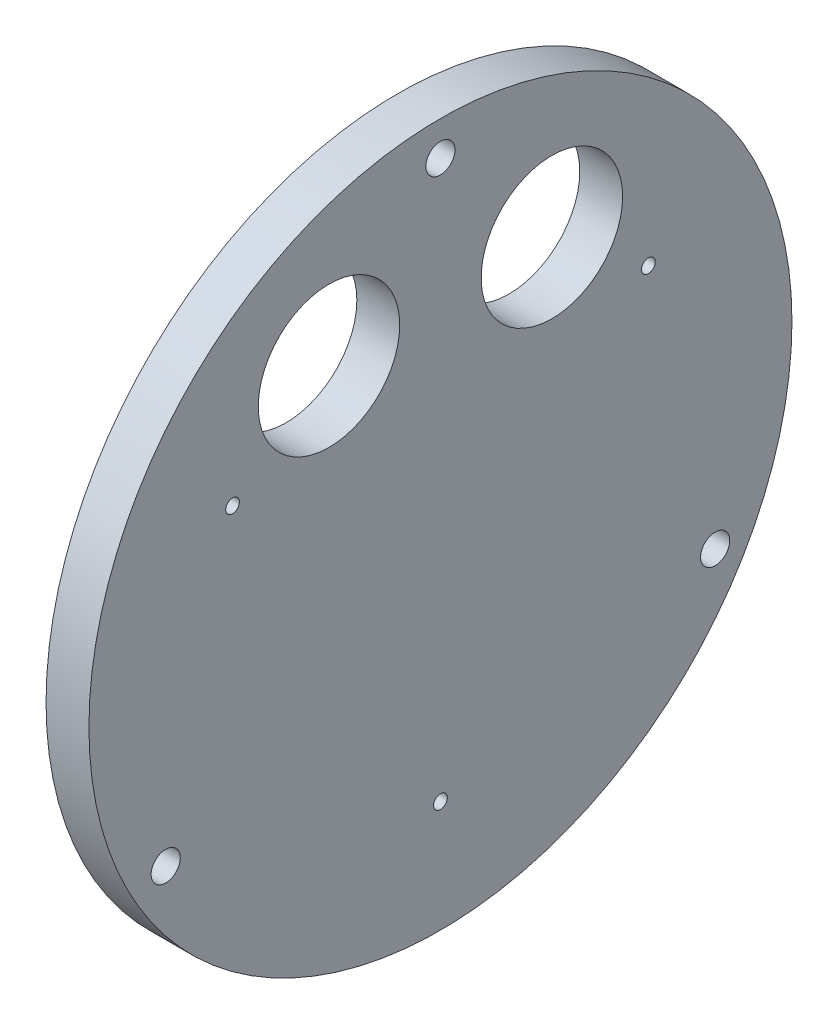
ISO-10303-21;
HEADER;
FILE_DESCRIPTION(('STEP AP214'),'2;1');
FILE_NAME('part.step','',(''),(''),'','','');
FILE_SCHEMA(('AUTOMOTIVE_DESIGN { 1 0 10303 214 1 1 1 1 }'));
ENDSEC;
DATA;
#1=APPLICATION_CONTEXT('core data for automotive mechanical design processes');
#2=APPLICATION_PROTOCOL_DEFINITION('international standard','automotive_design',2000,#1);
#3=PRODUCT_CONTEXT('',#1,'mechanical');
#4=PRODUCT('Part','Part','',(#3));
#5=PRODUCT_RELATED_PRODUCT_CATEGORY('part','',(#4));
#6=PRODUCT_DEFINITION_FORMATION('','',#4);
#7=PRODUCT_DEFINITION_CONTEXT('part definition',#1,'design');
#8=PRODUCT_DEFINITION('design','',#6,#7);
#9=PRODUCT_DEFINITION_SHAPE('','',#8);
#10=(LENGTH_UNIT() NAMED_UNIT(*) SI_UNIT(.MILLI.,.METRE.));
#11=(NAMED_UNIT(*) PLANE_ANGLE_UNIT() SI_UNIT($,.RADIAN.));
#12=(NAMED_UNIT(*) SI_UNIT($,.STERADIAN.) SOLID_ANGLE_UNIT());
#13=UNCERTAINTY_MEASURE_WITH_UNIT(LENGTH_MEASURE(1.E-05),#10,'distance_accuracy_value','');
#14=(GEOMETRIC_REPRESENTATION_CONTEXT(3) GLOBAL_UNCERTAINTY_ASSIGNED_CONTEXT((#13)) GLOBAL_UNIT_ASSIGNED_CONTEXT((#10,
#11,#12)) REPRESENTATION_CONTEXT('',''));
#15=CARTESIAN_POINT('',(0.,0.,0.));
#16=DIRECTION('',(0.,0.,1.));
#17=DIRECTION('',(1.,0.,0.));
#18=AXIS2_PLACEMENT_3D('',#15,#16,#17);
#19=CARTESIAN_POINT('',(-22.,41.,0.));
#20=DIRECTION('',(1.,0.,0.));
#21=DIRECTION('',(0.,0.,-1.));
#22=AXIS2_PLACEMENT_3D('',#19,#20,#21);
#23=PLANE('',#22);
#24=CARTESIAN_POINT('',(-22.,37.,0.));
#25=DIRECTION('',(1.,0.,0.));
#26=DIRECTION('',(0.,0.,-1.));
#27=AXIS2_PLACEMENT_3D('',#24,#25,#26);
#28=CIRCLE('',#27,1.7);
#29=CARTESIAN_POINT('',(-22.,37.,-1.7));
#30=VERTEX_POINT('',#29);
#31=EDGE_CURVE('E85',#30,#30,#28,.T.);
#32=ORIENTED_EDGE('',*,*,#31,.T.);
#33=EDGE_LOOP('',(#32));
#34=FACE_BOUND('',#33,.T.);
#35=CARTESIAN_POINT('',(-22.,-18.5,32.0429399400242));
#36=DIRECTION('',(1.,0.,0.));
#37=DIRECTION('',(0.,0.,-1.));
#38=AXIS2_PLACEMENT_3D('',#35,#36,#37);
#39=CIRCLE('',#38,1.7);
#40=CARTESIAN_POINT('',(-22.,-18.5,30.3429399400242));
#41=VERTEX_POINT('',#40);
#42=EDGE_CURVE('E78',#41,#41,#39,.T.);
#43=ORIENTED_EDGE('',*,*,#42,.T.);
#44=EDGE_LOOP('',(#43));
#45=FACE_BOUND('',#44,.T.);
#46=CARTESIAN_POINT('',(-22.,-18.5,-32.0429399400242));
#47=DIRECTION('',(1.,0.,0.));
#48=DIRECTION('',(0.,0.,-1.));
#49=AXIS2_PLACEMENT_3D('',#46,#47,#48);
#50=CIRCLE('',#49,1.7);
#51=CARTESIAN_POINT('',(-22.,-18.5,-33.7429399400242));
#52=VERTEX_POINT('',#51);
#53=EDGE_CURVE('E69',#52,#52,#50,.T.);
#54=ORIENTED_EDGE('',*,*,#53,.T.);
#55=EDGE_LOOP('',(#54));
#56=FACE_BOUND('',#55,.T.);
#57=CARTESIAN_POINT('',(-22.,22.5166604983954,13.));
#58=DIRECTION('',(1.,0.,0.));
#59=DIRECTION('',(0.,0.,-1.));
#60=AXIS2_PLACEMENT_3D('',#57,#58,#59);
#61=CIRCLE('',#60,8.25);
#62=CARTESIAN_POINT('',(-22.,22.5166604983954,4.75));
#63=VERTEX_POINT('',#62);
#64=EDGE_CURVE('E55',#63,#63,#61,.T.);
#65=ORIENTED_EDGE('',*,*,#64,.T.);
#66=EDGE_LOOP('',(#65));
#67=FACE_BOUND('',#66,.T.);
#68=CARTESIAN_POINT('',(-22.,22.5166604983954,-13.));
#69=DIRECTION('',(1.,0.,0.));
#70=DIRECTION('',(0.,0.,-1.));
#71=AXIS2_PLACEMENT_3D('',#68,#69,#70);
#72=CIRCLE('',#71,8.25);
#73=CARTESIAN_POINT('',(-22.,22.5166604983954,-21.25));
#74=VERTEX_POINT('',#73);
#75=EDGE_CURVE('E58',#74,#74,#72,.T.);
#76=ORIENTED_EDGE('',*,*,#75,.T.);
#77=EDGE_LOOP('',(#76));
#78=FACE_BOUND('',#77,.T.);
#79=CARTESIAN_POINT('',(-22.,0.,0.));
#80=DIRECTION('',(-1.,0.,0.));
#81=DIRECTION('',(0.,0.,1.));
#82=AXIS2_PLACEMENT_3D('',#79,#80,#81);
#83=CIRCLE('',#82,41.);
#84=CARTESIAN_POINT('',(-22.,0.,41.));
#85=VERTEX_POINT('',#84);
#86=EDGE_CURVE('E42',#85,#85,#83,.T.);
#87=ORIENTED_EDGE('',*,*,#86,.T.);
#88=EDGE_LOOP('',(#87));
#89=FACE_BOUND('',#88,.T.);
#90=ADVANCED_FACE('F35',(#34,#45,#56,#67,#78,#89),#23,.F.);
#91=CARTESIAN_POINT('',(-17.,0.,0.));
#92=DIRECTION('',(-1.,0.,0.));
#93=DIRECTION('',(0.,0.,1.));
#94=AXIS2_PLACEMENT_3D('',#91,#92,#93);
#95=PLANE('',#94);
#96=CARTESIAN_POINT('',(-17.,14.,24.2487113059643));
#97=DIRECTION('',(1.,0.,0.));
#98=DIRECTION('',(0.,0.,-1.));
#99=AXIS2_PLACEMENT_3D('',#96,#97,#98);
#100=CIRCLE('',#99,0.799999999999999);
#101=CARTESIAN_POINT('',(-17.,14.,23.4487113059643));
#102=VERTEX_POINT('',#101);
#103=EDGE_CURVE('E74',#102,#102,#100,.T.);
#104=ORIENTED_EDGE('',*,*,#103,.F.);
#105=EDGE_LOOP('',(#104));
#106=FACE_BOUND('',#105,.T.);
#107=CARTESIAN_POINT('',(-17.,-28.,0.));
#108=DIRECTION('',(1.,0.,0.));
#109=DIRECTION('',(0.,0.,-1.));
#110=AXIS2_PLACEMENT_3D('',#107,#108,#109);
#111=CIRCLE('',#110,0.8);
#112=CARTESIAN_POINT('',(-17.,-28.,-0.799999999999997));
#113=VERTEX_POINT('',#112);
#114=EDGE_CURVE('E104',#113,#113,#111,.T.);
#115=ORIENTED_EDGE('',*,*,#114,.F.);
#116=EDGE_LOOP('',(#115));
#117=FACE_BOUND('',#116,.T.);
#118=CARTESIAN_POINT('',(-17.,14.,-24.2487113059643));
#119=DIRECTION('',(1.,0.,0.));
#120=DIRECTION('',(0.,0.,-1.));
#121=AXIS2_PLACEMENT_3D('',#118,#119,#120);
#122=CIRCLE('',#121,0.799999999999999);
#123=CARTESIAN_POINT('',(-17.,14.,-25.0487113059643));
#124=VERTEX_POINT('',#123);
#125=EDGE_CURVE('E96',#124,#124,#122,.T.);
#126=ORIENTED_EDGE('',*,*,#125,.F.);
#127=EDGE_LOOP('',(#126));
#128=FACE_BOUND('',#127,.T.);
#129=CARTESIAN_POINT('',(-17.,37.,0.));
#130=DIRECTION('',(1.,0.,0.));
#131=DIRECTION('',(0.,0.,-1.));
#132=AXIS2_PLACEMENT_3D('',#129,#130,#131);
#133=CIRCLE('',#132,1.7);
#134=CARTESIAN_POINT('',(-17.,37.,-1.7));
#135=VERTEX_POINT('',#134);
#136=EDGE_CURVE('E63',#135,#135,#133,.T.);
#137=ORIENTED_EDGE('',*,*,#136,.F.);
#138=EDGE_LOOP('',(#137));
#139=FACE_BOUND('',#138,.T.);
#140=CARTESIAN_POINT('',(-17.,-18.5,32.0429399400242));
#141=DIRECTION('',(1.,0.,0.));
#142=DIRECTION('',(0.,0.,-1.));
#143=AXIS2_PLACEMENT_3D('',#140,#141,#142);
#144=CIRCLE('',#143,1.7);
#145=CARTESIAN_POINT('',(-17.,-18.5,30.3429399400242));
#146=VERTEX_POINT('',#145);
#147=EDGE_CURVE('E81',#146,#146,#144,.T.);
#148=ORIENTED_EDGE('',*,*,#147,.F.);
#149=EDGE_LOOP('',(#148));
#150=FACE_BOUND('',#149,.T.);
#151=CARTESIAN_POINT('',(-17.,-18.5,-32.0429399400242));
#152=DIRECTION('',(1.,0.,0.));
#153=DIRECTION('',(0.,0.,-1.));
#154=AXIS2_PLACEMENT_3D('',#151,#152,#153);
#155=CIRCLE('',#154,1.7);
#156=CARTESIAN_POINT('',(-17.,-18.5,-33.7429399400242));
#157=VERTEX_POINT('',#156);
#158=EDGE_CURVE('E73',#157,#157,#155,.T.);
#159=ORIENTED_EDGE('',*,*,#158,.F.);
#160=EDGE_LOOP('',(#159));
#161=FACE_BOUND('',#160,.T.);
#162=CARTESIAN_POINT('',(-17.,22.5166604983954,13.));
#163=DIRECTION('',(1.,0.,0.));
#164=DIRECTION('',(0.,0.,-1.));
#165=AXIS2_PLACEMENT_3D('',#162,#163,#164);
#166=CIRCLE('',#165,8.25);
#167=CARTESIAN_POINT('',(-17.,22.5166604983954,4.75));
#168=VERTEX_POINT('',#167);
#169=EDGE_CURVE('E49',#168,#168,#166,.T.);
#170=ORIENTED_EDGE('',*,*,#169,.F.);
#171=EDGE_LOOP('',(#170));
#172=FACE_BOUND('',#171,.T.);
#173=CARTESIAN_POINT('',(-17.,22.5166604983954,-13.));
#174=DIRECTION('',(1.,0.,0.));
#175=DIRECTION('',(0.,0.,-1.));
#176=AXIS2_PLACEMENT_3D('',#173,#174,#175);
#177=CIRCLE('',#176,8.25);
#178=CARTESIAN_POINT('',(-17.,22.5166604983954,-21.25));
#179=VERTEX_POINT('',#178);
#180=EDGE_CURVE('E62',#179,#179,#177,.T.);
#181=ORIENTED_EDGE('',*,*,#180,.F.);
#182=EDGE_LOOP('',(#181));
#183=FACE_BOUND('',#182,.T.);
#184=CARTESIAN_POINT('',(-17.,0.,0.));
#185=DIRECTION('',(-1.,0.,0.));
#186=DIRECTION('',(0.,0.,1.));
#187=AXIS2_PLACEMENT_3D('',#184,#185,#186);
#188=CIRCLE('',#187,41.);
#189=CARTESIAN_POINT('',(-17.,0.,41.));
#190=VERTEX_POINT('',#189);
#191=EDGE_CURVE('E10',#190,#190,#188,.T.);
#192=ORIENTED_EDGE('',*,*,#191,.F.);
#193=EDGE_LOOP('',(#192));
#194=FACE_BOUND('',#193,.T.);
#195=ADVANCED_FACE('F118',(#106,#117,#128,#139,#150,#161,#172,#183,#194),#95,.F.);
#196=CARTESIAN_POINT('',(-60.,0.,0.));
#197=DIRECTION('',(-1.,0.,0.));
#198=DIRECTION('',(0.,0.,1.));
#199=AXIS2_PLACEMENT_3D('',#196,#197,#198);
#200=CYLINDRICAL_SURFACE('',#199,41.);
#201=ORIENTED_EDGE('',*,*,#86,.F.);
#202=EDGE_LOOP('',(#201));
#203=FACE_BOUND('',#202,.T.);
#204=ORIENTED_EDGE('',*,*,#191,.T.);
#205=EDGE_LOOP('',(#204));
#206=FACE_BOUND('',#205,.T.);
#207=ADVANCED_FACE('F121',(#203,#206),#200,.T.);
#208=CARTESIAN_POINT('',(-17.,22.5166604983954,-13.));
#209=DIRECTION('',(-1.,0.,0.));
#210=DIRECTION('',(0.,0.,1.));
#211=AXIS2_PLACEMENT_3D('',#208,#209,#210);
#212=CYLINDRICAL_SURFACE('',#211,8.25);
#213=ORIENTED_EDGE('',*,*,#180,.T.);
#214=EDGE_LOOP('',(#213));
#215=FACE_BOUND('',#214,.T.);
#216=ORIENTED_EDGE('',*,*,#75,.F.);
#217=EDGE_LOOP('',(#216));
#218=FACE_BOUND('',#217,.T.);
#219=ADVANCED_FACE('F137',(#215,#218),#212,.F.);
#220=CARTESIAN_POINT('',(-17.,22.5166604983954,13.));
#221=DIRECTION('',(-1.,0.,0.));
#222=DIRECTION('',(0.,0.,1.));
#223=AXIS2_PLACEMENT_3D('',#220,#221,#222);
#224=CYLINDRICAL_SURFACE('',#223,8.25);
#225=ORIENTED_EDGE('',*,*,#169,.T.);
#226=EDGE_LOOP('',(#225));
#227=FACE_BOUND('',#226,.T.);
#228=ORIENTED_EDGE('',*,*,#64,.F.);
#229=EDGE_LOOP('',(#228));
#230=FACE_BOUND('',#229,.T.);
#231=ADVANCED_FACE('F140',(#227,#230),#224,.F.);
#232=CARTESIAN_POINT('',(-17.,-18.5,-32.0429399400242));
#233=DIRECTION('',(-1.,0.,0.));
#234=DIRECTION('',(0.,0.,1.));
#235=AXIS2_PLACEMENT_3D('',#232,#233,#234);
#236=CYLINDRICAL_SURFACE('',#235,1.7);
#237=ORIENTED_EDGE('',*,*,#158,.T.);
#238=EDGE_LOOP('',(#237));
#239=FACE_BOUND('',#238,.T.);
#240=ORIENTED_EDGE('',*,*,#53,.F.);
#241=EDGE_LOOP('',(#240));
#242=FACE_BOUND('',#241,.T.);
#243=ADVANCED_FACE('F157',(#239,#242),#236,.F.);
#244=CARTESIAN_POINT('',(-17.,-18.5,32.0429399400242));
#245=DIRECTION('',(-1.,0.,0.));
#246=DIRECTION('',(0.,0.,1.));
#247=AXIS2_PLACEMENT_3D('',#244,#245,#246);
#248=CYLINDRICAL_SURFACE('',#247,1.7);
#249=ORIENTED_EDGE('',*,*,#147,.T.);
#250=EDGE_LOOP('',(#249));
#251=FACE_BOUND('',#250,.T.);
#252=ORIENTED_EDGE('',*,*,#42,.F.);
#253=EDGE_LOOP('',(#252));
#254=FACE_BOUND('',#253,.T.);
#255=ADVANCED_FACE('F163',(#251,#254),#248,.F.);
#256=CARTESIAN_POINT('',(-17.,37.,0.));
#257=DIRECTION('',(-1.,0.,0.));
#258=DIRECTION('',(0.,0.,1.));
#259=AXIS2_PLACEMENT_3D('',#256,#257,#258);
#260=CYLINDRICAL_SURFACE('',#259,1.7);
#261=ORIENTED_EDGE('',*,*,#136,.T.);
#262=EDGE_LOOP('',(#261));
#263=FACE_BOUND('',#262,.T.);
#264=ORIENTED_EDGE('',*,*,#31,.F.);
#265=EDGE_LOOP('',(#264));
#266=FACE_BOUND('',#265,.T.);
#267=ADVANCED_FACE('F193',(#263,#266),#260,.F.);
#268=CARTESIAN_POINT('',(-17.,14.,-24.2487113059643));
#269=DIRECTION('',(-1.,0.,0.));
#270=DIRECTION('',(0.,0.,1.));
#271=AXIS2_PLACEMENT_3D('',#268,#269,#270);
#272=CYLINDRICAL_SURFACE('',#271,0.799999999999999);
#273=ORIENTED_EDGE('',*,*,#125,.T.);
#274=EDGE_LOOP('',(#273));
#275=FACE_BOUND('',#274,.T.);
#276=CARTESIAN_POINT('',(-20.,14.,-24.2487113059643));
#277=DIRECTION('',(1.,0.,0.));
#278=DIRECTION('',(0.,0.,-1.));
#279=AXIS2_PLACEMENT_3D('',#276,#277,#278);
#280=CIRCLE('',#279,0.799999999999999);
#281=CARTESIAN_POINT('',(-20.,14.,-25.0487113059643));
#282=VERTEX_POINT('',#281);
#283=EDGE_CURVE('E92',#282,#282,#280,.T.);
#284=ORIENTED_EDGE('',*,*,#283,.F.);
#285=EDGE_LOOP('',(#284));
#286=FACE_BOUND('',#285,.T.);
#287=ADVANCED_FACE('F201',(#275,#286),#272,.F.);
#288=CARTESIAN_POINT('',(-20.,14.,-24.2487113059643));
#289=DIRECTION('',(1.,0.,0.));
#290=DIRECTION('',(0.,0.,-1.));
#291=AXIS2_PLACEMENT_3D('',#288,#289,#290);
#292=PLANE('',#291);
#293=ORIENTED_EDGE('',*,*,#283,.T.);
#294=EDGE_LOOP('',(#293));
#295=FACE_BOUND('',#294,.T.);
#296=ADVANCED_FACE('F211',(#295),#292,.T.);
#297=CARTESIAN_POINT('',(-17.,-28.,0.));
#298=DIRECTION('',(-1.,0.,0.));
#299=DIRECTION('',(0.,0.,1.));
#300=AXIS2_PLACEMENT_3D('',#297,#298,#299);
#301=CYLINDRICAL_SURFACE('',#300,0.8);
#302=ORIENTED_EDGE('',*,*,#114,.T.);
#303=EDGE_LOOP('',(#302));
#304=FACE_BOUND('',#303,.T.);
#305=CARTESIAN_POINT('',(-20.,-28.,0.));
#306=DIRECTION('',(1.,0.,0.));
#307=DIRECTION('',(0.,0.,-1.));
#308=AXIS2_PLACEMENT_3D('',#305,#306,#307);
#309=CIRCLE('',#308,0.8);
#310=CARTESIAN_POINT('',(-20.,-28.,-0.799999999999997));
#311=VERTEX_POINT('',#310);
#312=EDGE_CURVE('E100',#311,#311,#309,.T.);
#313=ORIENTED_EDGE('',*,*,#312,.F.);
#314=EDGE_LOOP('',(#313));
#315=FACE_BOUND('',#314,.T.);
#316=ADVANCED_FACE('F220',(#304,#315),#301,.F.);
#317=CARTESIAN_POINT('',(-20.,-28.,0.));
#318=DIRECTION('',(1.,0.,0.));
#319=DIRECTION('',(0.,0.,-1.));
#320=AXIS2_PLACEMENT_3D('',#317,#318,#319);
#321=PLANE('',#320);
#322=ORIENTED_EDGE('',*,*,#312,.T.);
#323=EDGE_LOOP('',(#322));
#324=FACE_BOUND('',#323,.T.);
#325=ADVANCED_FACE('F229',(#324),#321,.T.);
#326=CARTESIAN_POINT('',(-17.,14.,24.2487113059643));
#327=DIRECTION('',(-1.,0.,0.));
#328=DIRECTION('',(0.,0.,1.));
#329=AXIS2_PLACEMENT_3D('',#326,#327,#328);
#330=CYLINDRICAL_SURFACE('',#329,0.799999999999999);
#331=ORIENTED_EDGE('',*,*,#103,.T.);
#332=EDGE_LOOP('',(#331));
#333=FACE_BOUND('',#332,.T.);
#334=CARTESIAN_POINT('',(-20.,14.,24.2487113059643));
#335=DIRECTION('',(1.,0.,0.));
#336=DIRECTION('',(0.,0.,-1.));
#337=AXIS2_PLACEMENT_3D('',#334,#335,#336);
#338=CIRCLE('',#337,0.799999999999999);
#339=CARTESIAN_POINT('',(-20.,14.,23.4487113059643));
#340=VERTEX_POINT('',#339);
#341=EDGE_CURVE('E108',#340,#340,#338,.T.);
#342=ORIENTED_EDGE('',*,*,#341,.F.);
#343=EDGE_LOOP('',(#342));
#344=FACE_BOUND('',#343,.T.);
#345=ADVANCED_FACE('F115',(#333,#344),#330,.F.);
#346=CARTESIAN_POINT('',(-20.,14.,24.2487113059643));
#347=DIRECTION('',(1.,0.,0.));
#348=DIRECTION('',(0.,0.,-1.));
#349=AXIS2_PLACEMENT_3D('',#346,#347,#348);
#350=PLANE('',#349);
#351=ORIENTED_EDGE('',*,*,#341,.T.);
#352=EDGE_LOOP('',(#351));
#353=FACE_BOUND('',#352,.T.);
#354=ADVANCED_FACE('F246',(#353),#350,.T.);
#355=CLOSED_SHELL('',(#90,#195,#207,#219,#231,#243,#255,#267,#287,#296,#316,#325,#345,#354));
#356=MANIFOLD_SOLID_BREP('B2',#355);
#357=ADVANCED_BREP_SHAPE_REPRESENTATION('',(#18,#356),#14);
#358=SHAPE_DEFINITION_REPRESENTATION(#9,#357);
ENDSEC;
END-ISO-10303-21;
